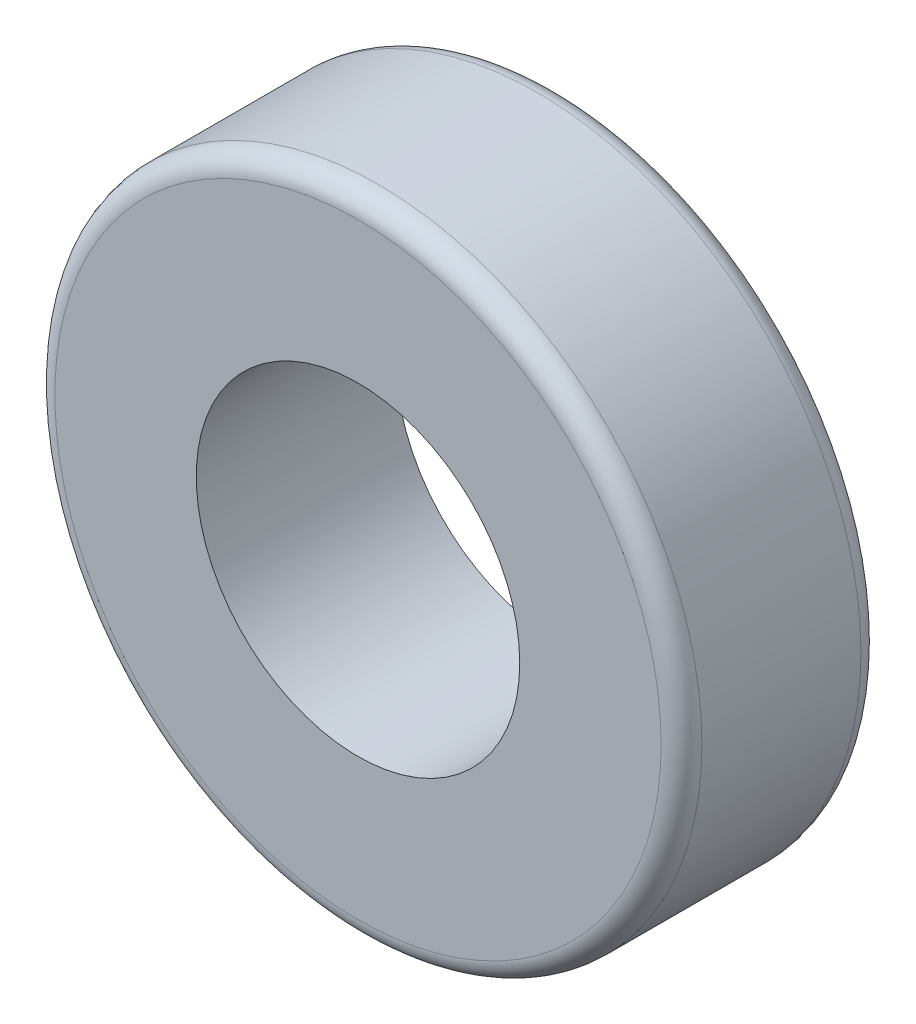
ISO-10303-21;
HEADER;
FILE_DESCRIPTION(('STEP AP214'),'2;1');
FILE_NAME('part.step','',(''),(''),'','','');
FILE_SCHEMA(('AUTOMOTIVE_DESIGN { 1 0 10303 214 1 1 1 1 }'));
ENDSEC;
DATA;
#1=APPLICATION_CONTEXT('core data for automotive mechanical design processes');
#2=APPLICATION_PROTOCOL_DEFINITION('international standard','automotive_design',2000,#1);
#3=PRODUCT_CONTEXT('',#1,'mechanical');
#4=PRODUCT('Part','Part','',(#3));
#5=PRODUCT_RELATED_PRODUCT_CATEGORY('part','',(#4));
#6=PRODUCT_DEFINITION_FORMATION('','',#4);
#7=PRODUCT_DEFINITION_CONTEXT('part definition',#1,'design');
#8=PRODUCT_DEFINITION('design','',#6,#7);
#9=PRODUCT_DEFINITION_SHAPE('','',#8);
#10=(LENGTH_UNIT() NAMED_UNIT(*) SI_UNIT(.MILLI.,.METRE.));
#11=(NAMED_UNIT(*) PLANE_ANGLE_UNIT() SI_UNIT($,.RADIAN.));
#12=(NAMED_UNIT(*) SI_UNIT($,.STERADIAN.) SOLID_ANGLE_UNIT());
#13=UNCERTAINTY_MEASURE_WITH_UNIT(LENGTH_MEASURE(1.E-05),#10,'distance_accuracy_value','');
#14=(GEOMETRIC_REPRESENTATION_CONTEXT(3) GLOBAL_UNCERTAINTY_ASSIGNED_CONTEXT((#13)) GLOBAL_UNIT_ASSIGNED_CONTEXT((#10,
#11,#12)) REPRESENTATION_CONTEXT('',''));
#15=CARTESIAN_POINT('',(0.,0.,0.));
#16=DIRECTION('',(0.,0.,1.));
#17=DIRECTION('',(1.,0.,0.));
#18=AXIS2_PLACEMENT_3D('',#15,#16,#17);
#19=CARTESIAN_POINT('',(0.,0.,4.9022));
#20=DIRECTION('',(0.,0.,1.));
#21=DIRECTION('',(1.,0.,0.));
#22=AXIS2_PLACEMENT_3D('',#19,#20,#21);
#23=PLANE('',#22);
#24=CARTESIAN_POINT('',(0.,0.,4.9022));
#25=DIRECTION('',(0.,0.,1.));
#26=DIRECTION('',(1.,0.,0.));
#27=AXIS2_PLACEMENT_3D('',#24,#25,#26);
#28=CIRCLE('',#27,7.4375);
#29=CARTESIAN_POINT('',(7.4375,0.,4.9022));
#30=VERTEX_POINT('',#29);
#31=EDGE_CURVE('E10',#30,#30,#28,.T.);
#32=ORIENTED_EDGE('',*,*,#31,.T.);
#33=EDGE_LOOP('',(#32));
#34=FACE_BOUND('',#33,.T.);
#35=CARTESIAN_POINT('',(0.,0.,4.9022));
#36=DIRECTION('',(0.,0.,1.));
#37=DIRECTION('',(1.,0.,0.));
#38=AXIS2_PLACEMENT_3D('',#35,#36,#37);
#39=CIRCLE('',#38,3.96875);
#40=CARTESIAN_POINT('',(3.96875,0.,4.9022));
#41=VERTEX_POINT('',#40);
#42=EDGE_CURVE('E49',#41,#41,#39,.T.);
#43=ORIENTED_EDGE('',*,*,#42,.F.);
#44=EDGE_LOOP('',(#43));
#45=FACE_BOUND('',#44,.T.);
#46=ADVANCED_FACE('F29',(#34,#45),#23,.T.);
#47=CARTESIAN_POINT('',(0.,0.,0.));
#48=DIRECTION('',(0.,0.,1.));
#49=DIRECTION('',(1.,0.,0.));
#50=AXIS2_PLACEMENT_3D('',#47,#48,#49);
#51=PLANE('',#50);
#52=CARTESIAN_POINT('',(0.,0.,0.));
#53=DIRECTION('',(0.,0.,1.));
#54=DIRECTION('',(1.,0.,0.));
#55=AXIS2_PLACEMENT_3D('',#52,#53,#54);
#56=CIRCLE('',#55,7.4375);
#57=CARTESIAN_POINT('',(7.4375,0.,0.));
#58=VERTEX_POINT('',#57);
#59=EDGE_CURVE('E36',#58,#58,#56,.F.);
#60=ORIENTED_EDGE('',*,*,#59,.T.);
#61=EDGE_LOOP('',(#60));
#62=FACE_BOUND('',#61,.T.);
#63=CARTESIAN_POINT('',(0.,0.,0.));
#64=DIRECTION('',(0.,0.,1.));
#65=DIRECTION('',(1.,0.,0.));
#66=AXIS2_PLACEMENT_3D('',#63,#64,#65);
#67=CIRCLE('',#66,3.96875);
#68=CARTESIAN_POINT('',(3.96875,0.,0.));
#69=VERTEX_POINT('',#68);
#70=EDGE_CURVE('E50',#69,#69,#67,.T.);
#71=ORIENTED_EDGE('',*,*,#70,.T.);
#72=EDGE_LOOP('',(#71));
#73=FACE_BOUND('',#72,.T.);
#74=ADVANCED_FACE('F60',(#62,#73),#51,.F.);
#75=CARTESIAN_POINT('',(0.,0.,4.9022));
#76=DIRECTION('',(0.,0.,-1.));
#77=DIRECTION('',(-1.,0.,0.));
#78=AXIS2_PLACEMENT_3D('',#75,#76,#77);
#79=CYLINDRICAL_SURFACE('',#78,7.9375);
#80=CARTESIAN_POINT('',(0.,0.,0.5));
#81=DIRECTION('',(0.,0.,1.));
#82=DIRECTION('',(1.,0.,0.));
#83=AXIS2_PLACEMENT_3D('',#80,#81,#82);
#84=CIRCLE('',#83,7.9375);
#85=CARTESIAN_POINT('',(7.9375,0.,0.5));
#86=VERTEX_POINT('',#85);
#87=EDGE_CURVE('E40',#86,#86,#84,.T.);
#88=ORIENTED_EDGE('',*,*,#87,.T.);
#89=EDGE_LOOP('',(#88));
#90=FACE_BOUND('',#89,.T.);
#91=CARTESIAN_POINT('',(0.,0.,4.4022));
#92=DIRECTION('',(0.,0.,1.));
#93=DIRECTION('',(1.,0.,0.));
#94=AXIS2_PLACEMENT_3D('',#91,#92,#93);
#95=CIRCLE('',#94,7.9375);
#96=CARTESIAN_POINT('',(7.9375,0.,4.4022));
#97=VERTEX_POINT('',#96);
#98=EDGE_CURVE('E44',#97,#97,#95,.F.);
#99=ORIENTED_EDGE('',*,*,#98,.T.);
#100=EDGE_LOOP('',(#99));
#101=FACE_BOUND('',#100,.T.);
#102=ADVANCED_FACE('F65',(#90,#101),#79,.T.);
#103=CARTESIAN_POINT('',(0.,0.,4.9022));
#104=DIRECTION('',(0.,0.,-1.));
#105=DIRECTION('',(-1.,0.,0.));
#106=AXIS2_PLACEMENT_3D('',#103,#104,#105);
#107=CYLINDRICAL_SURFACE('',#106,3.96875);
#108=ORIENTED_EDGE('',*,*,#42,.T.);
#109=EDGE_LOOP('',(#108));
#110=FACE_BOUND('',#109,.T.);
#111=ORIENTED_EDGE('',*,*,#70,.F.);
#112=EDGE_LOOP('',(#111));
#113=FACE_BOUND('',#112,.T.);
#114=ADVANCED_FACE('F56',(#110,#113),#107,.F.);
#115=CARTESIAN_POINT('',(0.,0.,0.5));
#116=DIRECTION('',(0.,0.,1.));
#117=DIRECTION('',(1.,0.,0.));
#118=AXIS2_PLACEMENT_3D('',#115,#116,#117);
#119=TOROIDAL_SURFACE('',#118,7.4375,0.5);
#120=ORIENTED_EDGE('',*,*,#59,.F.);
#121=EDGE_LOOP('',(#120));
#122=FACE_BOUND('',#121,.T.);
#123=ORIENTED_EDGE('',*,*,#87,.F.);
#124=EDGE_LOOP('',(#123));
#125=FACE_BOUND('',#124,.T.);
#126=ADVANCED_FACE('F71',(#122,#125),#119,.T.);
#127=CARTESIAN_POINT('',(0.,0.,4.4022));
#128=DIRECTION('',(0.,0.,1.));
#129=DIRECTION('',(1.,0.,0.));
#130=AXIS2_PLACEMENT_3D('',#127,#128,#129);
#131=TOROIDAL_SURFACE('',#130,7.4375,0.5);
#132=ORIENTED_EDGE('',*,*,#98,.F.);
#133=EDGE_LOOP('',(#132));
#134=FACE_BOUND('',#133,.T.);
#135=ORIENTED_EDGE('',*,*,#31,.F.);
#136=EDGE_LOOP('',(#135));
#137=FACE_BOUND('',#136,.T.);
#138=ADVANCED_FACE('F31',(#134,#137),#131,.T.);
#139=CLOSED_SHELL('',(#46,#74,#102,#114,#126,#138));
#140=MANIFOLD_SOLID_BREP('B2',#139);
#141=ADVANCED_BREP_SHAPE_REPRESENTATION('',(#18,#140),#14);
#142=SHAPE_DEFINITION_REPRESENTATION(#9,#141);
ENDSEC;
END-ISO-10303-21;
